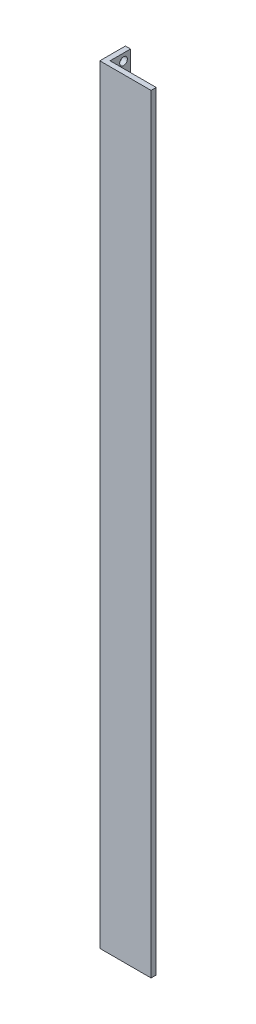
ISO-10303-21;
HEADER;
FILE_DESCRIPTION(('STEP AP214'),'2;1');
FILE_NAME('part.step','',(''),(''),'','','');
FILE_SCHEMA(('AUTOMOTIVE_DESIGN { 1 0 10303 214 1 1 1 1 }'));
ENDSEC;
DATA;
#1=APPLICATION_CONTEXT('core data for automotive mechanical design processes');
#2=APPLICATION_PROTOCOL_DEFINITION('international standard','automotive_design',2000,#1);
#3=PRODUCT_CONTEXT('',#1,'mechanical');
#4=PRODUCT('Part','Part','',(#3));
#5=PRODUCT_RELATED_PRODUCT_CATEGORY('part','',(#4));
#6=PRODUCT_DEFINITION_FORMATION('','',#4);
#7=PRODUCT_DEFINITION_CONTEXT('part definition',#1,'design');
#8=PRODUCT_DEFINITION('design','',#6,#7);
#9=PRODUCT_DEFINITION_SHAPE('','',#8);
#10=(LENGTH_UNIT() NAMED_UNIT(*) SI_UNIT(.MILLI.,.METRE.));
#11=(NAMED_UNIT(*) PLANE_ANGLE_UNIT() SI_UNIT($,.RADIAN.));
#12=(NAMED_UNIT(*) SI_UNIT($,.STERADIAN.) SOLID_ANGLE_UNIT());
#13=UNCERTAINTY_MEASURE_WITH_UNIT(LENGTH_MEASURE(1.E-05),#10,'distance_accuracy_value','');
#14=(GEOMETRIC_REPRESENTATION_CONTEXT(3) GLOBAL_UNCERTAINTY_ASSIGNED_CONTEXT((#13)) GLOBAL_UNIT_ASSIGNED_CONTEXT((#10,
#11,#12)) REPRESENTATION_CONTEXT('',''));
#15=CARTESIAN_POINT('',(0.,0.,0.));
#16=DIRECTION('',(0.,0.,1.));
#17=DIRECTION('',(1.,0.,0.));
#18=AXIS2_PLACEMENT_3D('',#15,#16,#17);
#19=CARTESIAN_POINT('',(20.,300.,0.));
#20=DIRECTION('',(0.,0.,-1.));
#21=DIRECTION('',(-1.,0.,0.));
#22=AXIS2_PLACEMENT_3D('',#19,#20,#21);
#23=PLANE('',#22);
#24=DIRECTION('',(1.,0.,0.));
#25=VECTOR('',#24,1.);
#26=CARTESIAN_POINT('',(20.,0.,0.));
#27=LINE('',#26,#25);
#28=CARTESIAN_POINT('',(0.,0.,0.));
#29=VERTEX_POINT('',#28);
#30=CARTESIAN_POINT('',(20.,0.,0.));
#31=VERTEX_POINT('',#30);
#32=EDGE_CURVE('E121',#29,#31,#27,.T.);
#33=ORIENTED_EDGE('',*,*,#32,.T.);
#34=DIRECTION('',(0.,-1.,0.));
#35=VECTOR('',#34,1.);
#36=CARTESIAN_POINT('',(20.,300.,0.));
#37=LINE('',#36,#35);
#38=CARTESIAN_POINT('',(20.,300.,0.));
#39=VERTEX_POINT('',#38);
#40=EDGE_CURVE('E11',#39,#31,#37,.T.);
#41=ORIENTED_EDGE('',*,*,#40,.F.);
#42=DIRECTION('',(1.,0.,0.));
#43=VECTOR('',#42,1.);
#44=CARTESIAN_POINT('',(20.,300.,0.));
#45=LINE('',#44,#43);
#46=CARTESIAN_POINT('',(0.,300.,0.));
#47=VERTEX_POINT('',#46);
#48=EDGE_CURVE('E132',#47,#39,#45,.T.);
#49=ORIENTED_EDGE('',*,*,#48,.F.);
#50=DIRECTION('',(0.,-1.,0.));
#51=VECTOR('',#50,1.);
#52=CARTESIAN_POINT('',(0.,300.,0.));
#53=LINE('',#52,#51);
#54=EDGE_CURVE('E117',#47,#29,#53,.T.);
#55=ORIENTED_EDGE('',*,*,#54,.T.);
#56=EDGE_LOOP('',(#33,#41,#49,#55));
#57=FACE_BOUND('',#56,.T.);
#58=ADVANCED_FACE('F37',(#57),#23,.F.);
#59=CARTESIAN_POINT('',(20.,300.,-2.));
#60=DIRECTION('',(-1.,0.,0.));
#61=DIRECTION('',(0.,0.,1.));
#62=AXIS2_PLACEMENT_3D('',#59,#60,#61);
#63=PLANE('',#62);
#64=DIRECTION('',(0.,0.,-1.));
#65=VECTOR('',#64,1.);
#66=CARTESIAN_POINT('',(20.,0.,-2.));
#67=LINE('',#66,#65);
#68=CARTESIAN_POINT('',(20.,0.,-2.));
#69=VERTEX_POINT('',#68);
#70=EDGE_CURVE('E124',#31,#69,#67,.T.);
#71=ORIENTED_EDGE('',*,*,#70,.T.);
#72=DIRECTION('',(0.,-1.,0.));
#73=VECTOR('',#72,1.);
#74=CARTESIAN_POINT('',(20.,300.,-2.));
#75=LINE('',#74,#73);
#76=CARTESIAN_POINT('',(20.,300.,-2.));
#77=VERTEX_POINT('',#76);
#78=EDGE_CURVE('E45',#77,#69,#75,.T.);
#79=ORIENTED_EDGE('',*,*,#78,.F.);
#80=DIRECTION('',(0.,0.,-1.));
#81=VECTOR('',#80,1.);
#82=CARTESIAN_POINT('',(20.,300.,-2.));
#83=LINE('',#82,#81);
#84=EDGE_CURVE('E90',#39,#77,#83,.T.);
#85=ORIENTED_EDGE('',*,*,#84,.F.);
#86=ORIENTED_EDGE('',*,*,#40,.T.);
#87=EDGE_LOOP('',(#71,#79,#85,#86));
#88=FACE_BOUND('',#87,.T.);
#89=ADVANCED_FACE('F159',(#88),#63,.F.);
#90=CARTESIAN_POINT('',(2.,300.,-2.));
#91=DIRECTION('',(0.,0.,1.));
#92=DIRECTION('',(1.,0.,0.));
#93=AXIS2_PLACEMENT_3D('',#90,#91,#92);
#94=PLANE('',#93);
#95=DIRECTION('',(-1.,0.,0.));
#96=VECTOR('',#95,1.);
#97=CARTESIAN_POINT('',(2.,0.,-2.));
#98=LINE('',#97,#96);
#99=CARTESIAN_POINT('',(2.,0.,-2.));
#100=VERTEX_POINT('',#99);
#101=EDGE_CURVE('E127',#69,#100,#98,.T.);
#102=ORIENTED_EDGE('',*,*,#101,.T.);
#103=DIRECTION('',(0.,-1.,0.));
#104=VECTOR('',#103,1.);
#105=CARTESIAN_POINT('',(2.,300.,-2.));
#106=LINE('',#105,#104);
#107=CARTESIAN_POINT('',(2.,300.,-2.));
#108=VERTEX_POINT('',#107);
#109=EDGE_CURVE('E112',#108,#100,#106,.T.);
#110=ORIENTED_EDGE('',*,*,#109,.F.);
#111=DIRECTION('',(-1.,0.,0.));
#112=VECTOR('',#111,1.);
#113=CARTESIAN_POINT('',(2.,300.,-2.));
#114=LINE('',#113,#112);
#115=EDGE_CURVE('E103',#77,#108,#114,.T.);
#116=ORIENTED_EDGE('',*,*,#115,.F.);
#117=ORIENTED_EDGE('',*,*,#78,.T.);
#118=EDGE_LOOP('',(#102,#110,#116,#117));
#119=FACE_BOUND('',#118,.T.);
#120=ADVANCED_FACE('F138',(#119),#94,.F.);
#121=CARTESIAN_POINT('',(2.,300.,-10.));
#122=DIRECTION('',(-1.,0.,0.));
#123=DIRECTION('',(0.,0.,1.));
#124=AXIS2_PLACEMENT_3D('',#121,#122,#123);
#125=PLANE('',#124);
#126=CARTESIAN_POINT('',(2.,36.0000000000047,-5.99999999999997));
#127=DIRECTION('',(1.,0.,0.));
#128=DIRECTION('',(0.,0.,-1.));
#129=AXIS2_PLACEMENT_3D('',#126,#127,#128);
#130=CIRCLE('',#129,1.49999999999999);
#131=CARTESIAN_POINT('',(2.,36.0000000000047,-7.49999999999996));
#132=VERTEX_POINT('',#131);
#133=EDGE_CURVE('E175',#132,#132,#130,.T.);
#134=ORIENTED_EDGE('',*,*,#133,.F.);
#135=EDGE_LOOP('',(#134));
#136=FACE_BOUND('',#135,.T.);
#137=CARTESIAN_POINT('',(2.,12.0000000000046,-5.99999999999997));
#138=DIRECTION('',(1.,0.,0.));
#139=DIRECTION('',(0.,0.,-1.));
#140=AXIS2_PLACEMENT_3D('',#137,#138,#139);
#141=CIRCLE('',#140,1.49999999999999);
#142=CARTESIAN_POINT('',(2.,12.0000000000046,-7.49999999999996));
#143=VERTEX_POINT('',#142);
#144=EDGE_CURVE('E179',#143,#143,#141,.T.);
#145=ORIENTED_EDGE('',*,*,#144,.F.);
#146=EDGE_LOOP('',(#145));
#147=FACE_BOUND('',#146,.T.);
#148=CARTESIAN_POINT('',(2.,88.7434385068108,-7.25846702780808));
#149=DIRECTION('',(-1.,0.,0.));
#150=DIRECTION('',(0.,0.,1.));
#151=AXIS2_PLACEMENT_3D('',#148,#149,#150);
#152=CIRCLE('',#151,1.5);
#153=CARTESIAN_POINT('',(2.,88.7434385068108,-5.75846702780808));
#154=VERTEX_POINT('',#153);
#155=EDGE_CURVE('E183',#154,#154,#152,.T.);
#156=ORIENTED_EDGE('',*,*,#155,.T.);
#157=EDGE_LOOP('',(#156));
#158=FACE_BOUND('',#157,.T.);
#159=CARTESIAN_POINT('',(2.,297.245406858167,-7.26261219671187));
#160=DIRECTION('',(-1.,0.,0.));
#161=DIRECTION('',(0.,0.,1.));
#162=AXIS2_PLACEMENT_3D('',#159,#160,#161);
#163=CIRCLE('',#162,1.5);
#164=CARTESIAN_POINT('',(2.,297.245406858167,-5.76261219671187));
#165=VERTEX_POINT('',#164);
#166=EDGE_CURVE('E125',#165,#165,#163,.T.);
#167=ORIENTED_EDGE('',*,*,#166,.T.);
#168=EDGE_LOOP('',(#167));
#169=FACE_BOUND('',#168,.T.);
#170=DIRECTION('',(0.,0.,-1.));
#171=VECTOR('',#170,1.);
#172=CARTESIAN_POINT('',(2.,0.,-10.));
#173=LINE('',#172,#171);
#174=CARTESIAN_POINT('',(2.,0.,-10.));
#175=VERTEX_POINT('',#174);
#176=EDGE_CURVE('E111',#100,#175,#173,.T.);
#177=ORIENTED_EDGE('',*,*,#176,.T.);
#178=DIRECTION('',(0.,-1.,0.));
#179=VECTOR('',#178,1.);
#180=CARTESIAN_POINT('',(2.,300.,-10.));
#181=LINE('',#180,#179);
#182=CARTESIAN_POINT('',(2.,300.,-10.));
#183=VERTEX_POINT('',#182);
#184=EDGE_CURVE('E108',#183,#175,#181,.T.);
#185=ORIENTED_EDGE('',*,*,#184,.F.);
#186=DIRECTION('',(0.,0.,-1.));
#187=VECTOR('',#186,1.);
#188=CARTESIAN_POINT('',(2.,300.,-10.));
#189=LINE('',#188,#187);
#190=EDGE_CURVE('E97',#108,#183,#189,.T.);
#191=ORIENTED_EDGE('',*,*,#190,.F.);
#192=ORIENTED_EDGE('',*,*,#109,.T.);
#193=EDGE_LOOP('',(#177,#185,#191,#192));
#194=FACE_BOUND('',#193,.T.);
#195=ADVANCED_FACE('F109',(#136,#147,#158,#169,#194),#125,.F.);
#196=CARTESIAN_POINT('',(0.,300.,-10.));
#197=DIRECTION('',(0.,0.,1.));
#198=DIRECTION('',(1.,0.,0.));
#199=AXIS2_PLACEMENT_3D('',#196,#197,#198);
#200=PLANE('',#199);
#201=DIRECTION('',(-1.,0.,0.));
#202=VECTOR('',#201,1.);
#203=CARTESIAN_POINT('',(0.,0.,-10.));
#204=LINE('',#203,#202);
#205=CARTESIAN_POINT('',(0.,0.,-10.));
#206=VERTEX_POINT('',#205);
#207=EDGE_CURVE('E76',#175,#206,#204,.T.);
#208=ORIENTED_EDGE('',*,*,#207,.T.);
#209=DIRECTION('',(0.,-1.,0.));
#210=VECTOR('',#209,1.);
#211=CARTESIAN_POINT('',(0.,300.,-10.));
#212=LINE('',#211,#210);
#213=CARTESIAN_POINT('',(0.,300.,-10.));
#214=VERTEX_POINT('',#213);
#215=EDGE_CURVE('E113',#214,#206,#212,.T.);
#216=ORIENTED_EDGE('',*,*,#215,.F.);
#217=DIRECTION('',(-1.,0.,0.));
#218=VECTOR('',#217,1.);
#219=CARTESIAN_POINT('',(0.,300.,-10.));
#220=LINE('',#219,#218);
#221=EDGE_CURVE('E101',#183,#214,#220,.T.);
#222=ORIENTED_EDGE('',*,*,#221,.F.);
#223=ORIENTED_EDGE('',*,*,#184,.T.);
#224=EDGE_LOOP('',(#208,#216,#222,#223));
#225=FACE_BOUND('',#224,.T.);
#226=ADVANCED_FACE('F115',(#225),#200,.F.);
#227=CARTESIAN_POINT('',(0.,300.,0.));
#228=DIRECTION('',(1.,0.,0.));
#229=DIRECTION('',(0.,0.,-1.));
#230=AXIS2_PLACEMENT_3D('',#227,#228,#229);
#231=PLANE('',#230);
#232=CARTESIAN_POINT('',(0.,36.0000000000047,-5.99999999999997));
#233=DIRECTION('',(1.,0.,0.));
#234=DIRECTION('',(0.,0.,-1.));
#235=AXIS2_PLACEMENT_3D('',#232,#233,#234);
#236=CIRCLE('',#235,1.49999999999999);
#237=CARTESIAN_POINT('',(0.,36.0000000000047,-7.49999999999996));
#238=VERTEX_POINT('',#237);
#239=EDGE_CURVE('E202',#238,#238,#236,.T.);
#240=ORIENTED_EDGE('',*,*,#239,.T.);
#241=EDGE_LOOP('',(#240));
#242=FACE_BOUND('',#241,.T.);
#243=CARTESIAN_POINT('',(0.,12.0000000000046,-5.99999999999997));
#244=DIRECTION('',(1.,0.,0.));
#245=DIRECTION('',(0.,0.,-1.));
#246=AXIS2_PLACEMENT_3D('',#243,#244,#245);
#247=CIRCLE('',#246,1.49999999999999);
#248=CARTESIAN_POINT('',(0.,12.0000000000046,-7.49999999999996));
#249=VERTEX_POINT('',#248);
#250=EDGE_CURVE('E198',#249,#249,#247,.T.);
#251=ORIENTED_EDGE('',*,*,#250,.T.);
#252=EDGE_LOOP('',(#251));
#253=FACE_BOUND('',#252,.T.);
#254=CARTESIAN_POINT('',(0.,88.7434385068108,-7.25846702780808));
#255=DIRECTION('',(-1.,0.,0.));
#256=DIRECTION('',(0.,0.,1.));
#257=AXIS2_PLACEMENT_3D('',#254,#255,#256);
#258=CIRCLE('',#257,1.5);
#259=CARTESIAN_POINT('',(0.,88.7434385068108,-5.75846702780808));
#260=VERTEX_POINT('',#259);
#261=EDGE_CURVE('E195',#260,#260,#258,.T.);
#262=ORIENTED_EDGE('',*,*,#261,.F.);
#263=EDGE_LOOP('',(#262));
#264=FACE_BOUND('',#263,.T.);
#265=CARTESIAN_POINT('',(0.,297.245406858167,-7.26261219671187));
#266=DIRECTION('',(-1.,0.,0.));
#267=DIRECTION('',(0.,0.,1.));
#268=AXIS2_PLACEMENT_3D('',#265,#266,#267);
#269=CIRCLE('',#268,1.5);
#270=CARTESIAN_POINT('',(0.,297.245406858167,-5.76261219671187));
#271=VERTEX_POINT('',#270);
#272=EDGE_CURVE('E187',#271,#271,#269,.T.);
#273=ORIENTED_EDGE('',*,*,#272,.F.);
#274=EDGE_LOOP('',(#273));
#275=FACE_BOUND('',#274,.T.);
#276=DIRECTION('',(0.,0.,1.));
#277=VECTOR('',#276,1.);
#278=CARTESIAN_POINT('',(0.,0.,0.));
#279=LINE('',#278,#277);
#280=EDGE_CURVE('E82',#206,#29,#279,.T.);
#281=ORIENTED_EDGE('',*,*,#280,.T.);
#282=ORIENTED_EDGE('',*,*,#54,.F.);
#283=DIRECTION('',(0.,0.,1.));
#284=VECTOR('',#283,1.);
#285=CARTESIAN_POINT('',(0.,300.,0.));
#286=LINE('',#285,#284);
#287=EDGE_CURVE('E53',#214,#47,#286,.T.);
#288=ORIENTED_EDGE('',*,*,#287,.F.);
#289=ORIENTED_EDGE('',*,*,#215,.T.);
#290=EDGE_LOOP('',(#281,#282,#288,#289));
#291=FACE_BOUND('',#290,.T.);
#292=ADVANCED_FACE('F145',(#242,#253,#264,#275,#291),#231,.F.);
#293=CARTESIAN_POINT('',(0.,300.,0.));
#294=DIRECTION('',(0.,-1.,0.));
#295=DIRECTION('',(0.,0.,-1.));
#296=AXIS2_PLACEMENT_3D('',#293,#294,#295);
#297=PLANE('',#296);
#298=ORIENTED_EDGE('',*,*,#48,.T.);
#299=ORIENTED_EDGE('',*,*,#84,.T.);
#300=ORIENTED_EDGE('',*,*,#115,.T.);
#301=ORIENTED_EDGE('',*,*,#190,.T.);
#302=ORIENTED_EDGE('',*,*,#221,.T.);
#303=ORIENTED_EDGE('',*,*,#287,.T.);
#304=EDGE_LOOP('',(#298,#299,#300,#301,#302,#303));
#305=FACE_BOUND('',#304,.T.);
#306=ADVANCED_FACE('F99',(#305),#297,.F.);
#307=CARTESIAN_POINT('',(0.,0.,0.));
#308=DIRECTION('',(0.,-1.,0.));
#309=DIRECTION('',(0.,0.,-1.));
#310=AXIS2_PLACEMENT_3D('',#307,#308,#309);
#311=PLANE('',#310);
#312=ORIENTED_EDGE('',*,*,#32,.F.);
#313=ORIENTED_EDGE('',*,*,#280,.F.);
#314=ORIENTED_EDGE('',*,*,#207,.F.);
#315=ORIENTED_EDGE('',*,*,#176,.F.);
#316=ORIENTED_EDGE('',*,*,#101,.F.);
#317=ORIENTED_EDGE('',*,*,#70,.F.);
#318=EDGE_LOOP('',(#312,#313,#314,#315,#316,#317));
#319=FACE_BOUND('',#318,.T.);
#320=ADVANCED_FACE('F141',(#319),#311,.T.);
#321=CARTESIAN_POINT('',(20.,297.245406858167,-7.26261219671187));
#322=DIRECTION('',(-1.,0.,0.));
#323=DIRECTION('',(0.,0.,1.));
#324=AXIS2_PLACEMENT_3D('',#321,#322,#323);
#325=CYLINDRICAL_SURFACE('',#324,1.5);
#326=ORIENTED_EDGE('',*,*,#272,.T.);
#327=EDGE_LOOP('',(#326));
#328=FACE_BOUND('',#327,.T.);
#329=ORIENTED_EDGE('',*,*,#166,.F.);
#330=EDGE_LOOP('',(#329));
#331=FACE_BOUND('',#330,.T.);
#332=ADVANCED_FACE('F220',(#328,#331),#325,.F.);
#333=CARTESIAN_POINT('',(20.,88.7434385068108,-7.25846702780808));
#334=DIRECTION('',(-1.,0.,0.));
#335=DIRECTION('',(0.,0.,1.));
#336=AXIS2_PLACEMENT_3D('',#333,#334,#335);
#337=CYLINDRICAL_SURFACE('',#336,1.5);
#338=ORIENTED_EDGE('',*,*,#261,.T.);
#339=EDGE_LOOP('',(#338));
#340=FACE_BOUND('',#339,.T.);
#341=ORIENTED_EDGE('',*,*,#155,.F.);
#342=EDGE_LOOP('',(#341));
#343=FACE_BOUND('',#342,.T.);
#344=ADVANCED_FACE('F213',(#340,#343),#337,.F.);
#345=CARTESIAN_POINT('',(2.,12.0000000000046,-5.99999999999997));
#346=DIRECTION('',(1.,0.,0.));
#347=DIRECTION('',(0.,0.,-1.));
#348=AXIS2_PLACEMENT_3D('',#345,#346,#347);
#349=CYLINDRICAL_SURFACE('',#348,1.49999999999999);
#350=ORIENTED_EDGE('',*,*,#250,.F.);
#351=EDGE_LOOP('',(#350));
#352=FACE_BOUND('',#351,.T.);
#353=ORIENTED_EDGE('',*,*,#144,.T.);
#354=EDGE_LOOP('',(#353));
#355=FACE_BOUND('',#354,.T.);
#356=ADVANCED_FACE('F207',(#352,#355),#349,.F.);
#357=CARTESIAN_POINT('',(2.,36.0000000000047,-5.99999999999997));
#358=DIRECTION('',(1.,0.,0.));
#359=DIRECTION('',(0.,0.,-1.));
#360=AXIS2_PLACEMENT_3D('',#357,#358,#359);
#361=CYLINDRICAL_SURFACE('',#360,1.49999999999999);
#362=ORIENTED_EDGE('',*,*,#239,.F.);
#363=EDGE_LOOP('',(#362));
#364=FACE_BOUND('',#363,.T.);
#365=ORIENTED_EDGE('',*,*,#133,.T.);
#366=EDGE_LOOP('',(#365));
#367=FACE_BOUND('',#366,.T.);
#368=ADVANCED_FACE('F205',(#364,#367),#361,.F.);
#369=CLOSED_SHELL('',(#58,#89,#120,#195,#226,#292,#306,#320,#332,#344,#356,#368));
#370=MANIFOLD_SOLID_BREP('B2',#369);
#371=ADVANCED_BREP_SHAPE_REPRESENTATION('',(#18,#370),#14);
#372=SHAPE_DEFINITION_REPRESENTATION(#9,#371);
ENDSEC;
END-ISO-10303-21;
